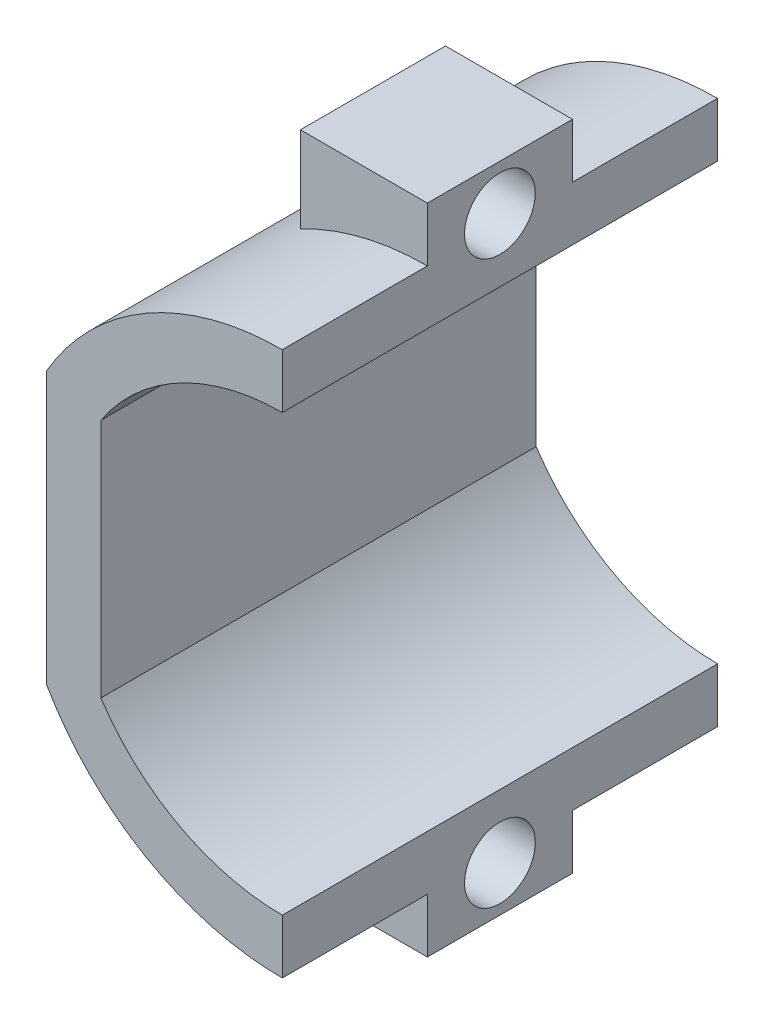
ISO-10303-21;
HEADER;
FILE_DESCRIPTION(('STEP AP214'),'2;1');
FILE_NAME('part.step','',(''),(''),'','','');
FILE_SCHEMA(('AUTOMOTIVE_DESIGN { 1 0 10303 214 1 1 1 1 }'));
ENDSEC;
DATA;
#1=APPLICATION_CONTEXT('core data for automotive mechanical design processes');
#2=APPLICATION_PROTOCOL_DEFINITION('international standard','automotive_design',2000,#1);
#3=PRODUCT_CONTEXT('',#1,'mechanical');
#4=PRODUCT('Part','Part','',(#3));
#5=PRODUCT_RELATED_PRODUCT_CATEGORY('part','',(#4));
#6=PRODUCT_DEFINITION_FORMATION('','',#4);
#7=PRODUCT_DEFINITION_CONTEXT('part definition',#1,'design');
#8=PRODUCT_DEFINITION('design','',#6,#7);
#9=PRODUCT_DEFINITION_SHAPE('','',#8);
#10=(LENGTH_UNIT() NAMED_UNIT(*) SI_UNIT(.MILLI.,.METRE.));
#11=(NAMED_UNIT(*) PLANE_ANGLE_UNIT() SI_UNIT($,.RADIAN.));
#12=(NAMED_UNIT(*) SI_UNIT($,.STERADIAN.) SOLID_ANGLE_UNIT());
#13=UNCERTAINTY_MEASURE_WITH_UNIT(LENGTH_MEASURE(1.E-05),#10,'distance_accuracy_value','');
#14=(GEOMETRIC_REPRESENTATION_CONTEXT(3) GLOBAL_UNCERTAINTY_ASSIGNED_CONTEXT((#13)) GLOBAL_UNIT_ASSIGNED_CONTEXT((#10,
#11,#12)) REPRESENTATION_CONTEXT('',''));
#15=CARTESIAN_POINT('',(0.,0.,0.));
#16=DIRECTION('',(0.,0.,1.));
#17=DIRECTION('',(1.,0.,0.));
#18=AXIS2_PLACEMENT_3D('',#15,#16,#17);
#19=CARTESIAN_POINT('',(0.,0.,0.));
#20=DIRECTION('',(0.,0.,1.));
#21=DIRECTION('',(1.,0.,0.));
#22=AXIS2_PLACEMENT_3D('',#19,#20,#21);
#23=PLANE('',#22);
#24=DIRECTION('',(0.,-1.,0.));
#25=VECTOR('',#24,1.);
#26=CARTESIAN_POINT('',(0.,0.,0.));
#27=LINE('',#26,#25);
#28=CARTESIAN_POINT('',(0.,-6.00000000000002,0.));
#29=VERTEX_POINT('',#28);
#30=CARTESIAN_POINT('',(0.,-7.50000000000002,1.2490009027033E-13));
#31=VERTEX_POINT('',#30);
#32=EDGE_CURVE('E230',#29,#31,#27,.T.);
#33=ORIENTED_EDGE('',*,*,#32,.T.);
#34=CARTESIAN_POINT('',(0.,0.,0.));
#35=DIRECTION('',(0.,0.,1.));
#36=DIRECTION('',(1.,0.,0.));
#37=AXIS2_PLACEMENT_3D('',#34,#35,#36);
#38=CIRCLE('',#37,7.5);
#39=CARTESIAN_POINT('',(-6.50107738392445,-3.73978513396516,1.2490009027033E-13));
#40=VERTEX_POINT('',#39);
#41=EDGE_CURVE('E233',#40,#31,#38,.T.);
#42=ORIENTED_EDGE('',*,*,#41,.F.);
#43=DIRECTION('',(0.,-1.,0.));
#44=VECTOR('',#43,1.);
#45=CARTESIAN_POINT('',(-6.50107738392439,0.,0.));
#46=LINE('',#45,#44);
#47=CARTESIAN_POINT('',(-6.50107738392439,3.73978513396516,1.2490009027033E-13));
#48=VERTEX_POINT('',#47);
#49=EDGE_CURVE('E232',#48,#40,#46,.T.);
#50=ORIENTED_EDGE('',*,*,#49,.F.);
#51=CARTESIAN_POINT('',(0.,7.49999999999994,0.));
#52=VERTEX_POINT('',#51);
#53=EDGE_CURVE('E229',#52,#48,#38,.T.);
#54=ORIENTED_EDGE('',*,*,#53,.F.);
#55=CARTESIAN_POINT('',(0.,5.99999999999994,0.));
#56=VERTEX_POINT('',#55);
#57=EDGE_CURVE('E208',#52,#56,#27,.T.);
#58=ORIENTED_EDGE('',*,*,#57,.T.);
#59=CARTESIAN_POINT('',(0.,0.,0.));
#60=DIRECTION('',(0.,0.,1.));
#61=DIRECTION('',(1.,0.,0.));
#62=AXIS2_PLACEMENT_3D('',#59,#60,#61);
#63=CIRCLE('',#62,6.);
#64=CARTESIAN_POINT('',(-5.00107738392439,3.315,0.));
#65=VERTEX_POINT('',#64);
#66=EDGE_CURVE('E215',#56,#65,#63,.T.);
#67=ORIENTED_EDGE('',*,*,#66,.T.);
#68=DIRECTION('',(0.,-1.,0.));
#69=VECTOR('',#68,1.);
#70=CARTESIAN_POINT('',(-5.00107738392439,0.,0.));
#71=LINE('',#70,#69);
#72=CARTESIAN_POINT('',(-5.00107738392445,-3.31500000000002,0.));
#73=VERTEX_POINT('',#72);
#74=EDGE_CURVE('E238',#65,#73,#71,.T.);
#75=ORIENTED_EDGE('',*,*,#74,.T.);
#76=EDGE_CURVE('E235',#73,#29,#63,.T.);
#77=ORIENTED_EDGE('',*,*,#76,.T.);
#78=EDGE_LOOP('',(#33,#42,#50,#54,#58,#67,#75,#77));
#79=FACE_BOUND('',#78,.T.);
#80=ADVANCED_FACE('F40',(#79),#23,.F.);
#81=CARTESIAN_POINT('',(0.,0.,12.));
#82=DIRECTION('',(1.,0.,0.));
#83=DIRECTION('',(0.,0.,-1.));
#84=AXIS2_PLACEMENT_3D('',#81,#82,#83);
#85=PLANE('',#84);
#86=CARTESIAN_POINT('',(0.,-7.75,6.00000000000012));
#87=DIRECTION('',(-1.,0.,0.));
#88=DIRECTION('',(0.,0.,-1.));
#89=AXIS2_PLACEMENT_3D('',#86,#87,#88);
#90=CIRCLE('',#89,0.975);
#91=CARTESIAN_POINT('',(0.,-7.75,5.02500000000012));
#92=VERTEX_POINT('',#91);
#93=EDGE_CURVE('E162',#92,#92,#90,.T.);
#94=ORIENTED_EDGE('',*,*,#93,.T.);
#95=EDGE_LOOP('',(#94));
#96=FACE_BOUND('',#95,.T.);
#97=DIRECTION('',(0.,-1.,0.));
#98=VECTOR('',#97,1.);
#99=CARTESIAN_POINT('',(0.,0.,4.));
#100=LINE('',#99,#98);
#101=CARTESIAN_POINT('',(0.,-7.50000000000003,4.00000000000012));
#102=VERTEX_POINT('',#101);
#103=CARTESIAN_POINT('',(0.,-9.,4.00000000000012));
#104=VERTEX_POINT('',#103);
#105=EDGE_CURVE('E48',#102,#104,#100,.T.);
#106=ORIENTED_EDGE('',*,*,#105,.F.);
#107=DIRECTION('',(0.,0.,-1.));
#108=VECTOR('',#107,1.);
#109=CARTESIAN_POINT('',(0.,-7.50000000000002,13.641075242112));
#110=LINE('',#109,#108);
#111=EDGE_CURVE('E12',#102,#31,#110,.T.);
#112=ORIENTED_EDGE('',*,*,#111,.T.);
#113=ORIENTED_EDGE('',*,*,#32,.F.);
#114=DIRECTION('',(0.,0.,-1.));
#115=VECTOR('',#114,1.);
#116=CARTESIAN_POINT('',(0.,-6.,12.0000000000001));
#117=LINE('',#116,#115);
#118=CARTESIAN_POINT('',(0.,-6.,12.0000000000001));
#119=VERTEX_POINT('',#118);
#120=EDGE_CURVE('E248',#119,#29,#117,.T.);
#121=ORIENTED_EDGE('',*,*,#120,.F.);
#122=DIRECTION('',(0.,-1.,0.));
#123=VECTOR('',#122,1.);
#124=CARTESIAN_POINT('',(0.,0.,12.));
#125=LINE('',#124,#123);
#126=CARTESIAN_POINT('',(0.,-7.50000000000003,12.0000000000001));
#127=VERTEX_POINT('',#126);
#128=EDGE_CURVE('E216',#119,#127,#125,.T.);
#129=ORIENTED_EDGE('',*,*,#128,.T.);
#130=DIRECTION('',(0.,0.,1.));
#131=VECTOR('',#130,1.);
#132=CARTESIAN_POINT('',(0.,-7.5,-1.64107524211178));
#133=LINE('',#132,#131);
#134=CARTESIAN_POINT('',(0.,-7.5,8.00000000000012));
#135=VERTEX_POINT('',#134);
#136=EDGE_CURVE('E173',#135,#127,#133,.T.);
#137=ORIENTED_EDGE('',*,*,#136,.F.);
#138=DIRECTION('',(0.,-1.,0.));
#139=VECTOR('',#138,1.);
#140=CARTESIAN_POINT('',(0.,0.,8.));
#141=LINE('',#140,#139);
#142=CARTESIAN_POINT('',(0.,-9.00000000000003,8.00000000000001));
#143=VERTEX_POINT('',#142);
#144=EDGE_CURVE('E269',#135,#143,#141,.T.);
#145=ORIENTED_EDGE('',*,*,#144,.T.);
#146=DIRECTION('',(0.,0.,1.));
#147=VECTOR('',#146,1.);
#148=CARTESIAN_POINT('',(0.,-9.,-4.22510444216538));
#149=LINE('',#148,#147);
#150=EDGE_CURVE('E169',#104,#143,#149,.T.);
#151=ORIENTED_EDGE('',*,*,#150,.F.);
#152=EDGE_LOOP('',(#106,#112,#113,#121,#129,#137,#145,#151));
#153=FACE_BOUND('',#152,.T.);
#154=ADVANCED_FACE('F267',(#96,#153),#85,.T.);
#155=CARTESIAN_POINT('',(0.,-9.,-4.22510444216538));
#156=DIRECTION('',(0.,1.,0.));
#157=DIRECTION('',(0.,0.,1.));
#158=AXIS2_PLACEMENT_3D('',#155,#156,#157);
#159=PLANE('',#158);
#160=DIRECTION('',(0.,0.,1.));
#161=VECTOR('',#160,1.);
#162=CARTESIAN_POINT('',(-3.5,-9.,-4.22510444216538));
#163=LINE('',#162,#161);
#164=CARTESIAN_POINT('',(-3.5,-9.,4.));
#165=VERTEX_POINT('',#164);
#166=CARTESIAN_POINT('',(-3.50000000000006,-9.,8.));
#167=VERTEX_POINT('',#166);
#168=EDGE_CURVE('E168',#165,#167,#163,.T.);
#169=ORIENTED_EDGE('',*,*,#168,.F.);
#170=DIRECTION('',(1.,0.,0.));
#171=VECTOR('',#170,1.);
#172=CARTESIAN_POINT('',(0.,-9.,4.00000000000012));
#173=LINE('',#172,#171);
#174=EDGE_CURVE('E155',#165,#104,#173,.T.);
#175=ORIENTED_EDGE('',*,*,#174,.T.);
#176=ORIENTED_EDGE('',*,*,#150,.T.);
#177=DIRECTION('',(1.,0.,0.));
#178=VECTOR('',#177,1.);
#179=CARTESIAN_POINT('',(0.,-9.00000000000003,8.00000000000001));
#180=LINE('',#179,#178);
#181=EDGE_CURVE('E273',#167,#143,#180,.T.);
#182=ORIENTED_EDGE('',*,*,#181,.F.);
#183=EDGE_LOOP('',(#169,#175,#176,#182));
#184=FACE_BOUND('',#183,.T.);
#185=ADVANCED_FACE('F262',(#184),#159,.F.);
#186=CARTESIAN_POINT('',(-3.5,0.,-4.22510444216538));
#187=DIRECTION('',(1.,0.,0.));
#188=DIRECTION('',(0.,1.,0.));
#189=AXIS2_PLACEMENT_3D('',#186,#187,#188);
#190=PLANE('',#189);
#191=CARTESIAN_POINT('',(-3.5,-7.75,6.));
#192=DIRECTION('',(1.,0.,0.));
#193=DIRECTION('',(0.,1.,0.));
#194=AXIS2_PLACEMENT_3D('',#191,#192,#193);
#195=CIRCLE('',#194,0.975);
#196=CARTESIAN_POINT('',(-3.5,-6.775,6.));
#197=VERTEX_POINT('',#196);
#198=EDGE_CURVE('E278',#197,#197,#195,.T.);
#199=ORIENTED_EDGE('',*,*,#198,.T.);
#200=EDGE_LOOP('',(#199));
#201=FACE_BOUND('',#200,.T.);
#202=DIRECTION('',(0.,0.,1.));
#203=VECTOR('',#202,1.);
#204=CARTESIAN_POINT('',(-3.50000000000006,-6.6332495807108,-4.22510444216538));
#205=LINE('',#204,#203);
#206=CARTESIAN_POINT('',(-3.5,-6.63324958071083,4.));
#207=VERTEX_POINT('',#206);
#208=CARTESIAN_POINT('',(-3.5,-6.6332495807108,8.));
#209=VERTEX_POINT('',#208);
#210=EDGE_CURVE('E62',#207,#209,#205,.T.);
#211=ORIENTED_EDGE('',*,*,#210,.F.);
#212=DIRECTION('',(0.,-1.,0.));
#213=VECTOR('',#212,1.);
#214=CARTESIAN_POINT('',(-3.5,0.,4.));
#215=LINE('',#214,#213);
#216=EDGE_CURVE('E152',#207,#165,#215,.T.);
#217=ORIENTED_EDGE('',*,*,#216,.T.);
#218=ORIENTED_EDGE('',*,*,#168,.T.);
#219=DIRECTION('',(0.,-1.,0.));
#220=VECTOR('',#219,1.);
#221=CARTESIAN_POINT('',(-3.5,0.,8.));
#222=LINE('',#221,#220);
#223=EDGE_CURVE('E167',#209,#167,#222,.T.);
#224=ORIENTED_EDGE('',*,*,#223,.F.);
#225=EDGE_LOOP('',(#211,#217,#218,#224));
#226=FACE_BOUND('',#225,.T.);
#227=ADVANCED_FACE('F165',(#201,#226),#190,.F.);
#228=CARTESIAN_POINT('',(0.,0.,12.));
#229=DIRECTION('',(0.,0.,-1.));
#230=DIRECTION('',(-1.,0.,0.));
#231=AXIS2_PLACEMENT_3D('',#228,#229,#230);
#232=CYLINDRICAL_SURFACE('',#231,7.5);
#233=ORIENTED_EDGE('',*,*,#41,.T.);
#234=ORIENTED_EDGE('',*,*,#111,.F.);
#235=CARTESIAN_POINT('',(0.,0.,4.));
#236=DIRECTION('',(0.,0.,1.));
#237=DIRECTION('',(1.,0.,0.));
#238=AXIS2_PLACEMENT_3D('',#235,#236,#237);
#239=CIRCLE('',#238,7.5);
#240=EDGE_CURVE('E55',#102,#207,#239,.F.);
#241=ORIENTED_EDGE('',*,*,#240,.T.);
#242=ORIENTED_EDGE('',*,*,#210,.T.);
#243=CARTESIAN_POINT('',(0.,0.,8.));
#244=DIRECTION('',(0.,0.,1.));
#245=DIRECTION('',(1.,0.,0.));
#246=AXIS2_PLACEMENT_3D('',#243,#244,#245);
#247=CIRCLE('',#246,7.5);
#248=EDGE_CURVE('E158',#209,#135,#247,.T.);
#249=ORIENTED_EDGE('',*,*,#248,.T.);
#250=ORIENTED_EDGE('',*,*,#136,.T.);
#251=CARTESIAN_POINT('',(0.,0.,12.));
#252=DIRECTION('',(0.,0.,1.));
#253=DIRECTION('',(1.,0.,0.));
#254=AXIS2_PLACEMENT_3D('',#251,#252,#253);
#255=CIRCLE('',#254,7.5);
#256=CARTESIAN_POINT('',(-6.50107738392439,-3.73978513396515,12.0000000000001));
#257=VERTEX_POINT('',#256);
#258=EDGE_CURVE('E219',#257,#127,#255,.T.);
#259=ORIENTED_EDGE('',*,*,#258,.F.);
#260=DIRECTION('',(0.,0.,-1.));
#261=VECTOR('',#260,1.);
#262=CARTESIAN_POINT('',(-6.50107738392439,-3.73978513396515,12.0000000000001));
#263=LINE('',#262,#261);
#264=EDGE_CURVE('E250',#257,#40,#263,.T.);
#265=ORIENTED_EDGE('',*,*,#264,.T.);
#266=EDGE_LOOP('',(#233,#234,#241,#242,#249,#250,#259,#265));
#267=FACE_BOUND('',#266,.T.);
#268=ADVANCED_FACE('F160',(#267),#232,.T.);
#269=CARTESIAN_POINT('',(0.,7.75,6.00000000000001));
#270=DIRECTION('',(1.,0.,0.));
#271=DIRECTION('',(0.,0.,-1.));
#272=AXIS2_PLACEMENT_3D('',#269,#270,#271);
#273=CIRCLE('',#272,0.975);
#274=CARTESIAN_POINT('',(0.,7.75,5.025));
#275=VERTEX_POINT('',#274);
#276=EDGE_CURVE('E177',#275,#275,#273,.T.);
#277=ORIENTED_EDGE('',*,*,#276,.F.);
#278=EDGE_LOOP('',(#277));
#279=FACE_BOUND('',#278,.T.);
#280=DIRECTION('',(0.,-1.,0.));
#281=VECTOR('',#280,1.);
#282=CARTESIAN_POINT('',(0.,0.,4.));
#283=LINE('',#282,#281);
#284=CARTESIAN_POINT('',(0.,9.,4.));
#285=VERTEX_POINT('',#284);
#286=CARTESIAN_POINT('',(0.,7.49999999999994,4.));
#287=VERTEX_POINT('',#286);
#288=EDGE_CURVE('E191',#285,#287,#283,.T.);
#289=ORIENTED_EDGE('',*,*,#288,.F.);
#290=DIRECTION('',(0.,0.,1.));
#291=VECTOR('',#290,1.);
#292=CARTESIAN_POINT('',(0.,9.,-4.22510444216513));
#293=LINE('',#292,#291);
#294=CARTESIAN_POINT('',(0.,9.,8.));
#295=VERTEX_POINT('',#294);
#296=EDGE_CURVE('E206',#285,#295,#293,.T.);
#297=ORIENTED_EDGE('',*,*,#296,.T.);
#298=DIRECTION('',(0.,-1.,0.));
#299=VECTOR('',#298,1.);
#300=CARTESIAN_POINT('',(0.,0.,8.));
#301=LINE('',#300,#299);
#302=CARTESIAN_POINT('',(0.,7.5,8.));
#303=VERTEX_POINT('',#302);
#304=EDGE_CURVE('E199',#295,#303,#301,.T.);
#305=ORIENTED_EDGE('',*,*,#304,.T.);
#306=DIRECTION('',(0.,0.,1.));
#307=VECTOR('',#306,1.);
#308=CARTESIAN_POINT('',(0.,7.5,-1.6410752421119));
#309=LINE('',#308,#307);
#310=CARTESIAN_POINT('',(0.,7.49999999999994,12.));
#311=VERTEX_POINT('',#310);
#312=EDGE_CURVE('E202',#303,#311,#309,.T.);
#313=ORIENTED_EDGE('',*,*,#312,.T.);
#314=CARTESIAN_POINT('',(0.,5.99999999999994,12.));
#315=VERTEX_POINT('',#314);
#316=EDGE_CURVE('E212',#311,#315,#125,.T.);
#317=ORIENTED_EDGE('',*,*,#316,.T.);
#318=DIRECTION('',(0.,0.,-1.));
#319=VECTOR('',#318,1.);
#320=CARTESIAN_POINT('',(0.,5.99999999999994,12.));
#321=LINE('',#320,#319);
#322=EDGE_CURVE('E241',#315,#56,#321,.T.);
#323=ORIENTED_EDGE('',*,*,#322,.T.);
#324=ORIENTED_EDGE('',*,*,#57,.F.);
#325=DIRECTION('',(0.,0.,-1.));
#326=VECTOR('',#325,1.);
#327=CARTESIAN_POINT('',(0.,7.5,13.6410752421119));
#328=LINE('',#327,#326);
#329=EDGE_CURVE('E184',#287,#52,#328,.T.);
#330=ORIENTED_EDGE('',*,*,#329,.F.);
#331=EDGE_LOOP('',(#289,#297,#305,#313,#317,#323,#324,#330));
#332=FACE_BOUND('',#331,.T.);
#333=ADVANCED_FACE('F297',(#279,#332),#85,.T.);
#334=CARTESIAN_POINT('',(0.,0.,12.));
#335=DIRECTION('',(0.,0.,1.));
#336=DIRECTION('',(1.,0.,0.));
#337=AXIS2_PLACEMENT_3D('',#334,#335,#336);
#338=PLANE('',#337);
#339=ORIENTED_EDGE('',*,*,#258,.T.);
#340=ORIENTED_EDGE('',*,*,#128,.F.);
#341=CARTESIAN_POINT('',(0.,0.,12.));
#342=DIRECTION('',(0.,0.,1.));
#343=DIRECTION('',(1.,0.,0.));
#344=AXIS2_PLACEMENT_3D('',#341,#342,#343);
#345=CIRCLE('',#344,6.);
#346=CARTESIAN_POINT('',(-5.00107738392439,-3.31499999999997,12.));
#347=VERTEX_POINT('',#346);
#348=EDGE_CURVE('E221',#347,#119,#345,.T.);
#349=ORIENTED_EDGE('',*,*,#348,.F.);
#350=DIRECTION('',(0.,-1.,0.));
#351=VECTOR('',#350,1.);
#352=CARTESIAN_POINT('',(-5.00107738392439,0.,12.));
#353=LINE('',#352,#351);
#354=CARTESIAN_POINT('',(-5.00107738392439,3.31500000000003,12.));
#355=VERTEX_POINT('',#354);
#356=EDGE_CURVE('E224',#355,#347,#353,.T.);
#357=ORIENTED_EDGE('',*,*,#356,.F.);
#358=EDGE_CURVE('E225',#315,#355,#345,.T.);
#359=ORIENTED_EDGE('',*,*,#358,.F.);
#360=ORIENTED_EDGE('',*,*,#316,.F.);
#361=CARTESIAN_POINT('',(-6.50107738392439,3.73978513396516,12.));
#362=VERTEX_POINT('',#361);
#363=EDGE_CURVE('E214',#311,#362,#255,.T.);
#364=ORIENTED_EDGE('',*,*,#363,.T.);
#365=DIRECTION('',(0.,-1.,0.));
#366=VECTOR('',#365,1.);
#367=CARTESIAN_POINT('',(-6.50107738392439,0.,12.));
#368=LINE('',#367,#366);
#369=EDGE_CURVE('E218',#362,#257,#368,.T.);
#370=ORIENTED_EDGE('',*,*,#369,.T.);
#371=EDGE_LOOP('',(#339,#340,#349,#357,#359,#360,#364,#370));
#372=FACE_BOUND('',#371,.T.);
#373=ADVANCED_FACE('F311',(#372),#338,.T.);
#374=CARTESIAN_POINT('',(0.,9.,-4.22510444216513));
#375=DIRECTION('',(0.,1.,0.));
#376=DIRECTION('',(0.,0.,1.));
#377=AXIS2_PLACEMENT_3D('',#374,#375,#376);
#378=PLANE('',#377);
#379=DIRECTION('',(1.,0.,0.));
#380=VECTOR('',#379,1.);
#381=CARTESIAN_POINT('',(0.,9.,4.));
#382=LINE('',#381,#380);
#383=CARTESIAN_POINT('',(-3.50000000000006,9.,4.));
#384=VERTEX_POINT('',#383);
#385=EDGE_CURVE('E189',#384,#285,#382,.T.);
#386=ORIENTED_EDGE('',*,*,#385,.F.);
#387=DIRECTION('',(0.,0.,1.));
#388=VECTOR('',#387,1.);
#389=CARTESIAN_POINT('',(-3.5,9.,-4.22510444216513));
#390=LINE('',#389,#388);
#391=CARTESIAN_POINT('',(-3.5,9.,8.));
#392=VERTEX_POINT('',#391);
#393=EDGE_CURVE('E205',#384,#392,#390,.T.);
#394=ORIENTED_EDGE('',*,*,#393,.T.);
#395=DIRECTION('',(1.,0.,0.));
#396=VECTOR('',#395,1.);
#397=CARTESIAN_POINT('',(0.,9.,8.));
#398=LINE('',#397,#396);
#399=EDGE_CURVE('E196',#392,#295,#398,.T.);
#400=ORIENTED_EDGE('',*,*,#399,.T.);
#401=ORIENTED_EDGE('',*,*,#296,.F.);
#402=EDGE_LOOP('',(#386,#394,#400,#401));
#403=FACE_BOUND('',#402,.T.);
#404=ADVANCED_FACE('F367',(#403),#378,.T.);
#405=CARTESIAN_POINT('',(-3.5,0.,-4.22510444216538));
#406=DIRECTION('',(-1.,0.,0.));
#407=DIRECTION('',(0.,-1.,0.));
#408=AXIS2_PLACEMENT_3D('',#405,#406,#407);
#409=PLANE('',#408);
#410=CARTESIAN_POINT('',(-3.5,7.75,6.));
#411=DIRECTION('',(-1.,0.,0.));
#412=DIRECTION('',(0.,-1.,0.));
#413=AXIS2_PLACEMENT_3D('',#410,#411,#412);
#414=CIRCLE('',#413,0.975);
#415=CARTESIAN_POINT('',(-3.5,6.775,6.));
#416=VERTEX_POINT('',#415);
#417=EDGE_CURVE('E171',#416,#416,#414,.F.);
#418=ORIENTED_EDGE('',*,*,#417,.T.);
#419=EDGE_LOOP('',(#418));
#420=FACE_BOUND('',#419,.T.);
#421=DIRECTION('',(0.,1.,0.));
#422=VECTOR('',#421,1.);
#423=CARTESIAN_POINT('',(-3.5,0.,4.));
#424=LINE('',#423,#422);
#425=CARTESIAN_POINT('',(-3.5,6.6332495807108,4.));
#426=VERTEX_POINT('',#425);
#427=EDGE_CURVE('E187',#426,#384,#424,.T.);
#428=ORIENTED_EDGE('',*,*,#427,.F.);
#429=DIRECTION('',(0.,0.,1.));
#430=VECTOR('',#429,1.);
#431=CARTESIAN_POINT('',(-3.5,6.6332495807108,-4.22510444216535));
#432=LINE('',#431,#430);
#433=CARTESIAN_POINT('',(-3.5,6.6332495807108,8.));
#434=VERTEX_POINT('',#433);
#435=EDGE_CURVE('E209',#426,#434,#432,.T.);
#436=ORIENTED_EDGE('',*,*,#435,.T.);
#437=DIRECTION('',(0.,1.,0.));
#438=VECTOR('',#437,1.);
#439=CARTESIAN_POINT('',(-3.5,0.,8.));
#440=LINE('',#439,#438);
#441=EDGE_CURVE('E256',#434,#392,#440,.T.);
#442=ORIENTED_EDGE('',*,*,#441,.T.);
#443=ORIENTED_EDGE('',*,*,#393,.F.);
#444=EDGE_LOOP('',(#428,#436,#442,#443));
#445=FACE_BOUND('',#444,.T.);
#446=ADVANCED_FACE('F361',(#420,#445),#409,.T.);
#447=ORIENTED_EDGE('',*,*,#435,.F.);
#448=CARTESIAN_POINT('',(0.,0.,4.));
#449=DIRECTION('',(0.,0.,1.));
#450=DIRECTION('',(1.,0.,0.));
#451=AXIS2_PLACEMENT_3D('',#448,#449,#450);
#452=CIRCLE('',#451,7.5);
#453=EDGE_CURVE('E180',#287,#426,#452,.T.);
#454=ORIENTED_EDGE('',*,*,#453,.F.);
#455=ORIENTED_EDGE('',*,*,#329,.T.);
#456=ORIENTED_EDGE('',*,*,#53,.T.);
#457=DIRECTION('',(0.,0.,-1.));
#458=VECTOR('',#457,1.);
#459=CARTESIAN_POINT('',(-6.50107738392439,3.73978513396516,12.));
#460=LINE('',#459,#458);
#461=EDGE_CURVE('E253',#362,#48,#460,.T.);
#462=ORIENTED_EDGE('',*,*,#461,.F.);
#463=ORIENTED_EDGE('',*,*,#363,.F.);
#464=ORIENTED_EDGE('',*,*,#312,.F.);
#465=CARTESIAN_POINT('',(0.,0.,8.));
#466=DIRECTION('',(0.,0.,1.));
#467=DIRECTION('',(1.,0.,0.));
#468=AXIS2_PLACEMENT_3D('',#465,#466,#467);
#469=CIRCLE('',#468,7.5);
#470=EDGE_CURVE('E193',#434,#303,#469,.F.);
#471=ORIENTED_EDGE('',*,*,#470,.F.);
#472=EDGE_LOOP('',(#447,#454,#455,#456,#462,#463,#464,#471));
#473=FACE_BOUND('',#472,.T.);
#474=ADVANCED_FACE('F298',(#473),#232,.T.);
#475=CARTESIAN_POINT('',(-6.50107738392439,0.,12.));
#476=DIRECTION('',(1.,0.,0.));
#477=DIRECTION('',(0.,0.,-1.));
#478=AXIS2_PLACEMENT_3D('',#475,#476,#477);
#479=PLANE('',#478);
#480=ORIENTED_EDGE('',*,*,#49,.T.);
#481=ORIENTED_EDGE('',*,*,#264,.F.);
#482=ORIENTED_EDGE('',*,*,#369,.F.);
#483=ORIENTED_EDGE('',*,*,#461,.T.);
#484=EDGE_LOOP('',(#480,#481,#482,#483));
#485=FACE_BOUND('',#484,.T.);
#486=ADVANCED_FACE('F42',(#485),#479,.F.);
#487=CARTESIAN_POINT('',(0.,0.,12.));
#488=DIRECTION('',(0.,0.,-1.));
#489=DIRECTION('',(-1.,0.,0.));
#490=AXIS2_PLACEMENT_3D('',#487,#488,#489);
#491=CYLINDRICAL_SURFACE('',#490,6.);
#492=ORIENTED_EDGE('',*,*,#76,.F.);
#493=DIRECTION('',(0.,0.,-1.));
#494=VECTOR('',#493,1.);
#495=CARTESIAN_POINT('',(-5.00107738392439,-3.31499999999997,12.));
#496=LINE('',#495,#494);
#497=EDGE_CURVE('E246',#347,#73,#496,.T.);
#498=ORIENTED_EDGE('',*,*,#497,.F.);
#499=ORIENTED_EDGE('',*,*,#348,.T.);
#500=ORIENTED_EDGE('',*,*,#120,.T.);
#501=EDGE_LOOP('',(#492,#498,#499,#500));
#502=FACE_BOUND('',#501,.T.);
#503=ADVANCED_FACE('F319',(#502),#491,.F.);
#504=CARTESIAN_POINT('',(-5.00107738392439,0.,12.));
#505=DIRECTION('',(1.,0.,0.));
#506=DIRECTION('',(0.,0.,-1.));
#507=AXIS2_PLACEMENT_3D('',#504,#505,#506);
#508=PLANE('',#507);
#509=ORIENTED_EDGE('',*,*,#74,.F.);
#510=DIRECTION('',(0.,0.,-1.));
#511=VECTOR('',#510,1.);
#512=CARTESIAN_POINT('',(-5.00107738392439,3.31500000000003,12.));
#513=LINE('',#512,#511);
#514=EDGE_CURVE('E244',#355,#65,#513,.T.);
#515=ORIENTED_EDGE('',*,*,#514,.F.);
#516=ORIENTED_EDGE('',*,*,#356,.T.);
#517=ORIENTED_EDGE('',*,*,#497,.T.);
#518=EDGE_LOOP('',(#509,#515,#516,#517));
#519=FACE_BOUND('',#518,.T.);
#520=ADVANCED_FACE('F317',(#519),#508,.T.);
#521=ORIENTED_EDGE('',*,*,#66,.F.);
#522=ORIENTED_EDGE('',*,*,#322,.F.);
#523=ORIENTED_EDGE('',*,*,#358,.T.);
#524=ORIENTED_EDGE('',*,*,#514,.T.);
#525=EDGE_LOOP('',(#521,#522,#523,#524));
#526=FACE_BOUND('',#525,.T.);
#527=ADVANCED_FACE('F313',(#526),#491,.F.);
#528=CARTESIAN_POINT('',(0.,0.,8.));
#529=DIRECTION('',(0.,0.,1.));
#530=DIRECTION('',(1.,0.,0.));
#531=AXIS2_PLACEMENT_3D('',#528,#529,#530);
#532=PLANE('',#531);
#533=ORIENTED_EDGE('',*,*,#399,.F.);
#534=ORIENTED_EDGE('',*,*,#441,.F.);
#535=ORIENTED_EDGE('',*,*,#470,.T.);
#536=ORIENTED_EDGE('',*,*,#304,.F.);
#537=EDGE_LOOP('',(#533,#534,#535,#536));
#538=FACE_BOUND('',#537,.T.);
#539=ADVANCED_FACE('F316',(#538),#532,.T.);
#540=CARTESIAN_POINT('',(0.,0.,4.));
#541=DIRECTION('',(0.,0.,1.));
#542=DIRECTION('',(1.,0.,0.));
#543=AXIS2_PLACEMENT_3D('',#540,#541,#542);
#544=PLANE('',#543);
#545=ORIENTED_EDGE('',*,*,#288,.T.);
#546=ORIENTED_EDGE('',*,*,#453,.T.);
#547=ORIENTED_EDGE('',*,*,#427,.T.);
#548=ORIENTED_EDGE('',*,*,#385,.T.);
#549=EDGE_LOOP('',(#545,#546,#547,#548));
#550=FACE_BOUND('',#549,.T.);
#551=ADVANCED_FACE('F364',(#550),#544,.F.);
#552=CARTESIAN_POINT('',(-6.50207738392439,7.75000000000006,6.00000000000012));
#553=DIRECTION('',(1.,0.,0.));
#554=DIRECTION('',(0.,0.,-1.));
#555=AXIS2_PLACEMENT_3D('',#552,#553,#554);
#556=CYLINDRICAL_SURFACE('',#555,0.975);
#557=ORIENTED_EDGE('',*,*,#417,.F.);
#558=EDGE_LOOP('',(#557));
#559=FACE_BOUND('',#558,.T.);
#560=ORIENTED_EDGE('',*,*,#276,.T.);
#561=EDGE_LOOP('',(#560));
#562=FACE_BOUND('',#561,.T.);
#563=ADVANCED_FACE('F380',(#559,#562),#556,.F.);
#564=CARTESIAN_POINT('',(0.,0.,8.));
#565=DIRECTION('',(0.,0.,1.));
#566=DIRECTION('',(1.,0.,0.));
#567=AXIS2_PLACEMENT_3D('',#564,#565,#566);
#568=PLANE('',#567);
#569=ORIENTED_EDGE('',*,*,#248,.F.);
#570=ORIENTED_EDGE('',*,*,#223,.T.);
#571=ORIENTED_EDGE('',*,*,#181,.T.);
#572=ORIENTED_EDGE('',*,*,#144,.F.);
#573=EDGE_LOOP('',(#569,#570,#571,#572));
#574=FACE_BOUND('',#573,.T.);
#575=ADVANCED_FACE('F382',(#574),#568,.T.);
#576=CARTESIAN_POINT('',(0.,0.,4.));
#577=DIRECTION('',(0.,0.,1.));
#578=DIRECTION('',(1.,0.,0.));
#579=AXIS2_PLACEMENT_3D('',#576,#577,#578);
#580=PLANE('',#579);
#581=ORIENTED_EDGE('',*,*,#240,.F.);
#582=ORIENTED_EDGE('',*,*,#105,.T.);
#583=ORIENTED_EDGE('',*,*,#174,.F.);
#584=ORIENTED_EDGE('',*,*,#216,.F.);
#585=EDGE_LOOP('',(#581,#582,#583,#584));
#586=FACE_BOUND('',#585,.T.);
#587=ADVANCED_FACE('F153',(#586),#580,.F.);
#588=CARTESIAN_POINT('',(-6.50207738392439,-7.75,6.00000000000012));
#589=DIRECTION('',(1.,0.,0.));
#590=DIRECTION('',(0.,0.,-1.));
#591=AXIS2_PLACEMENT_3D('',#588,#589,#590);
#592=CYLINDRICAL_SURFACE('',#591,0.975);
#593=ORIENTED_EDGE('',*,*,#93,.F.);
#594=EDGE_LOOP('',(#593));
#595=FACE_BOUND('',#594,.T.);
#596=ORIENTED_EDGE('',*,*,#198,.F.);
#597=EDGE_LOOP('',(#596));
#598=FACE_BOUND('',#597,.T.);
#599=ADVANCED_FACE('F285',(#595,#598),#592,.F.);
#600=CLOSED_SHELL('',(#80,#154,#185,#227,#268,#333,#373,#404,#446,#474,#486,#503,#520,#527,#539,
#551,#563,#575,#587,#599));
#601=MANIFOLD_SOLID_BREP('B2',#600);
#602=ADVANCED_BREP_SHAPE_REPRESENTATION('',(#18,#601),#14);
#603=SHAPE_DEFINITION_REPRESENTATION(#9,#602);
ENDSEC;
END-ISO-10303-21;
